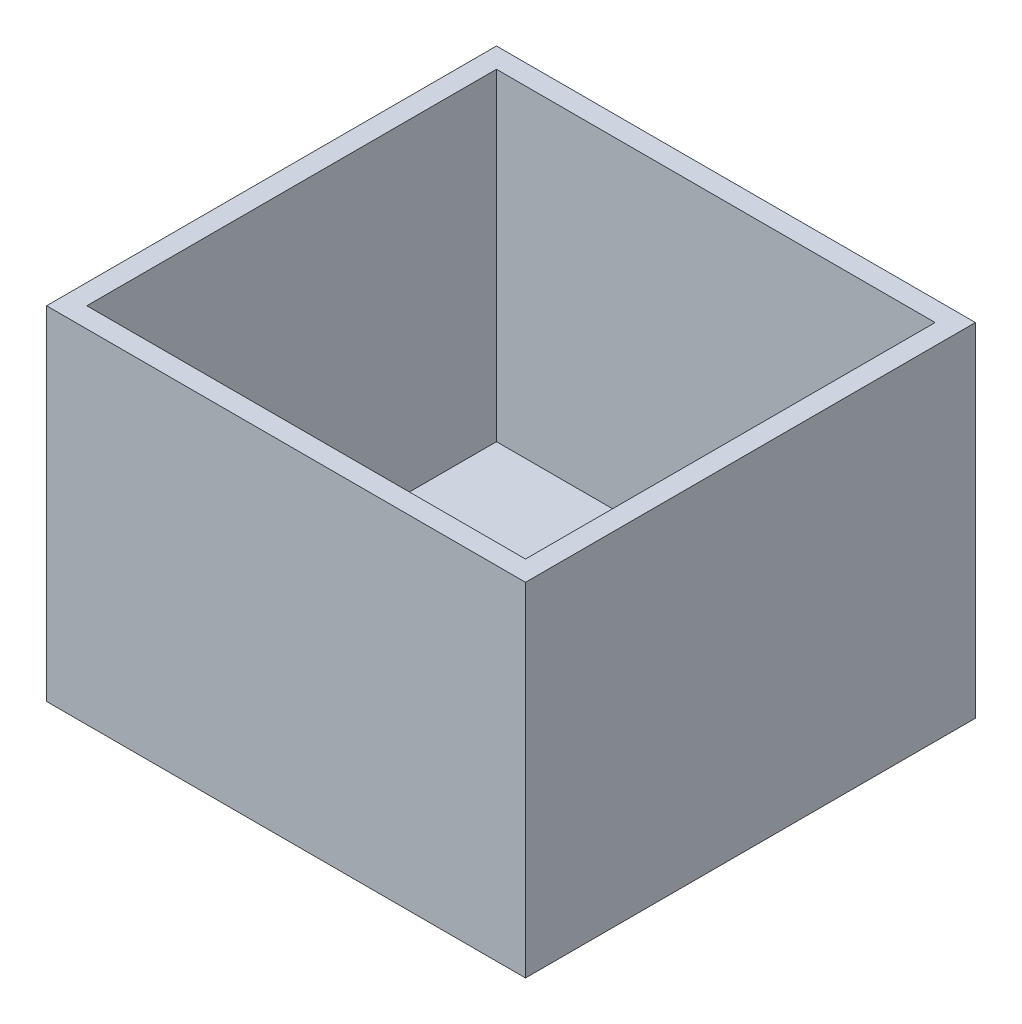
ISO-10303-21;
HEADER;
FILE_DESCRIPTION(('STEP AP214'),'2;1');
FILE_NAME('part.step','',(''),(''),'','','');
FILE_SCHEMA(('AUTOMOTIVE_DESIGN { 1 0 10303 214 1 1 1 1 }'));
ENDSEC;
DATA;
#1=APPLICATION_CONTEXT('core data for automotive mechanical design processes');
#2=APPLICATION_PROTOCOL_DEFINITION('international standard','automotive_design',2000,#1);
#3=PRODUCT_CONTEXT('',#1,'mechanical');
#4=PRODUCT('Part','Part','',(#3));
#5=PRODUCT_RELATED_PRODUCT_CATEGORY('part','',(#4));
#6=PRODUCT_DEFINITION_FORMATION('','',#4);
#7=PRODUCT_DEFINITION_CONTEXT('part definition',#1,'design');
#8=PRODUCT_DEFINITION('design','',#6,#7);
#9=PRODUCT_DEFINITION_SHAPE('','',#8);
#10=(LENGTH_UNIT() NAMED_UNIT(*) SI_UNIT(.MILLI.,.METRE.));
#11=(NAMED_UNIT(*) PLANE_ANGLE_UNIT() SI_UNIT($,.RADIAN.));
#12=(NAMED_UNIT(*) SI_UNIT($,.STERADIAN.) SOLID_ANGLE_UNIT());
#13=UNCERTAINTY_MEASURE_WITH_UNIT(LENGTH_MEASURE(1.E-05),#10,'distance_accuracy_value','');
#14=(GEOMETRIC_REPRESENTATION_CONTEXT(3) GLOBAL_UNCERTAINTY_ASSIGNED_CONTEXT((#13)) GLOBAL_UNIT_ASSIGNED_CONTEXT((#10,
#11,#12)) REPRESENTATION_CONTEXT('',''));
#15=CARTESIAN_POINT('',(0.,0.,0.));
#16=DIRECTION('',(0.,0.,1.));
#17=DIRECTION('',(1.,0.,0.));
#18=AXIS2_PLACEMENT_3D('',#15,#16,#17);
#19=CARTESIAN_POINT('',(-3.175,50.8,0.));
#20=DIRECTION('',(1.,0.,0.));
#21=DIRECTION('',(0.,0.,-1.));
#22=AXIS2_PLACEMENT_3D('',#19,#20,#21);
#23=PLANE('',#22);
#24=DIRECTION('',(0.,0.,1.));
#25=VECTOR('',#24,1.);
#26=CARTESIAN_POINT('',(-3.175,-3.175,0.));
#27=LINE('',#26,#25);
#28=CARTESIAN_POINT('',(-3.175,-3.175,-3.175));
#29=VERTEX_POINT('',#28);
#30=CARTESIAN_POINT('',(-3.17499999999999,-3.175,67.691));
#31=VERTEX_POINT('',#30);
#32=EDGE_CURVE('E121',#29,#31,#27,.T.);
#33=ORIENTED_EDGE('',*,*,#32,.T.);
#34=DIRECTION('',(0.,-1.,0.));
#35=VECTOR('',#34,1.);
#36=CARTESIAN_POINT('',(-3.17499999999999,50.8,67.691));
#37=LINE('',#36,#35);
#38=CARTESIAN_POINT('',(-3.17499999999999,50.8,67.691));
#39=VERTEX_POINT('',#38);
#40=EDGE_CURVE('E11',#39,#31,#37,.T.);
#41=ORIENTED_EDGE('',*,*,#40,.F.);
#42=DIRECTION('',(0.,0.,1.));
#43=VECTOR('',#42,1.);
#44=CARTESIAN_POINT('',(-3.175,50.8,0.));
#45=LINE('',#44,#43);
#46=CARTESIAN_POINT('',(-3.175,50.8,-3.175));
#47=VERTEX_POINT('',#46);
#48=EDGE_CURVE('E157',#47,#39,#45,.T.);
#49=ORIENTED_EDGE('',*,*,#48,.F.);
#50=DIRECTION('',(0.,-1.,0.));
#51=VECTOR('',#50,1.);
#52=CARTESIAN_POINT('',(-3.175,50.8,-3.175));
#53=LINE('',#52,#51);
#54=EDGE_CURVE('E144',#47,#29,#53,.T.);
#55=ORIENTED_EDGE('',*,*,#54,.T.);
#56=EDGE_LOOP('',(#33,#41,#49,#55));
#57=FACE_BOUND('',#56,.T.);
#58=ADVANCED_FACE('F33',(#57),#23,.F.);
#59=CARTESIAN_POINT('',(0.,50.8,67.691));
#60=DIRECTION('',(0.,0.,-1.));
#61=DIRECTION('',(-1.,0.,0.));
#62=AXIS2_PLACEMENT_3D('',#59,#60,#61);
#63=PLANE('',#62);
#64=DIRECTION('',(1.,0.,0.));
#65=VECTOR('',#64,1.);
#66=CARTESIAN_POINT('',(0.,-3.175,67.691));
#67=LINE('',#66,#65);
#68=CARTESIAN_POINT('',(72.263,-3.175,67.691));
#69=VERTEX_POINT('',#68);
#70=EDGE_CURVE('E142',#31,#69,#67,.T.);
#71=ORIENTED_EDGE('',*,*,#70,.T.);
#72=DIRECTION('',(0.,-1.,0.));
#73=VECTOR('',#72,1.);
#74=CARTESIAN_POINT('',(72.263,50.8,67.691));
#75=LINE('',#74,#73);
#76=CARTESIAN_POINT('',(72.263,50.8,67.691));
#77=VERTEX_POINT('',#76);
#78=EDGE_CURVE('E42',#77,#69,#75,.T.);
#79=ORIENTED_EDGE('',*,*,#78,.F.);
#80=DIRECTION('',(1.,0.,0.));
#81=VECTOR('',#80,1.);
#82=CARTESIAN_POINT('',(0.,50.8,67.691));
#83=LINE('',#82,#81);
#84=EDGE_CURVE('E159',#39,#77,#83,.T.);
#85=ORIENTED_EDGE('',*,*,#84,.F.);
#86=ORIENTED_EDGE('',*,*,#40,.T.);
#87=EDGE_LOOP('',(#71,#79,#85,#86));
#88=FACE_BOUND('',#87,.T.);
#89=ADVANCED_FACE('F175',(#88),#63,.F.);
#90=CARTESIAN_POINT('',(72.263,50.8,0.));
#91=DIRECTION('',(-1.,0.,0.));
#92=DIRECTION('',(0.,0.,1.));
#93=AXIS2_PLACEMENT_3D('',#90,#91,#92);
#94=PLANE('',#93);
#95=DIRECTION('',(0.,0.,-1.));
#96=VECTOR('',#95,1.);
#97=CARTESIAN_POINT('',(72.263,-3.175,0.));
#98=LINE('',#97,#96);
#99=CARTESIAN_POINT('',(72.263,-3.175,-3.175));
#100=VERTEX_POINT('',#99);
#101=EDGE_CURVE('E149',#69,#100,#98,.T.);
#102=ORIENTED_EDGE('',*,*,#101,.T.);
#103=DIRECTION('',(0.,-1.,0.));
#104=VECTOR('',#103,1.);
#105=CARTESIAN_POINT('',(72.263,50.8,-3.175));
#106=LINE('',#105,#104);
#107=CARTESIAN_POINT('',(72.263,50.8,-3.175));
#108=VERTEX_POINT('',#107);
#109=EDGE_CURVE('E147',#108,#100,#106,.T.);
#110=ORIENTED_EDGE('',*,*,#109,.F.);
#111=DIRECTION('',(0.,0.,-1.));
#112=VECTOR('',#111,1.);
#113=CARTESIAN_POINT('',(72.263,50.8,0.));
#114=LINE('',#113,#112);
#115=EDGE_CURVE('E160',#77,#108,#114,.T.);
#116=ORIENTED_EDGE('',*,*,#115,.F.);
#117=ORIENTED_EDGE('',*,*,#78,.T.);
#118=EDGE_LOOP('',(#102,#110,#116,#117));
#119=FACE_BOUND('',#118,.T.);
#120=ADVANCED_FACE('F165',(#119),#94,.F.);
#121=CARTESIAN_POINT('',(0.,50.8,-3.175));
#122=DIRECTION('',(0.,0.,1.));
#123=DIRECTION('',(1.,0.,0.));
#124=AXIS2_PLACEMENT_3D('',#121,#122,#123);
#125=PLANE('',#124);
#126=DIRECTION('',(-1.,0.,0.));
#127=VECTOR('',#126,1.);
#128=CARTESIAN_POINT('',(0.,-3.175,-3.175));
#129=LINE('',#128,#127);
#130=EDGE_CURVE('E153',#100,#29,#129,.T.);
#131=ORIENTED_EDGE('',*,*,#130,.T.);
#132=ORIENTED_EDGE('',*,*,#54,.F.);
#133=DIRECTION('',(-1.,0.,0.));
#134=VECTOR('',#133,1.);
#135=CARTESIAN_POINT('',(0.,50.8,-3.175));
#136=LINE('',#135,#134);
#137=EDGE_CURVE('E37',#108,#47,#136,.T.);
#138=ORIENTED_EDGE('',*,*,#137,.F.);
#139=ORIENTED_EDGE('',*,*,#109,.T.);
#140=EDGE_LOOP('',(#131,#132,#138,#139));
#141=FACE_BOUND('',#140,.T.);
#142=ADVANCED_FACE('F169',(#141),#125,.F.);
#143=CARTESIAN_POINT('',(0.,50.8,0.));
#144=DIRECTION('',(0.,1.,0.));
#145=DIRECTION('',(0.,0.,1.));
#146=AXIS2_PLACEMENT_3D('',#143,#144,#145);
#147=PLANE('',#146);
#148=DIRECTION('',(0.,0.,1.));
#149=VECTOR('',#148,1.);
#150=CARTESIAN_POINT('',(0.,50.8,0.));
#151=LINE('',#150,#149);
#152=CARTESIAN_POINT('',(0.,50.8,0.));
#153=VERTEX_POINT('',#152);
#154=CARTESIAN_POINT('',(0.,50.8,64.516));
#155=VERTEX_POINT('',#154);
#156=EDGE_CURVE('E102',#153,#155,#151,.T.);
#157=ORIENTED_EDGE('',*,*,#156,.F.);
#158=DIRECTION('',(-1.,0.,0.));
#159=VECTOR('',#158,1.);
#160=CARTESIAN_POINT('',(0.,50.8,0.));
#161=LINE('',#160,#159);
#162=CARTESIAN_POINT('',(69.088,50.8,0.));
#163=VERTEX_POINT('',#162);
#164=EDGE_CURVE('E128',#163,#153,#161,.T.);
#165=ORIENTED_EDGE('',*,*,#164,.F.);
#166=DIRECTION('',(0.,0.,-1.));
#167=VECTOR('',#166,1.);
#168=CARTESIAN_POINT('',(69.088,50.8,0.));
#169=LINE('',#168,#167);
#170=CARTESIAN_POINT('',(69.088,50.8,64.516));
#171=VERTEX_POINT('',#170);
#172=EDGE_CURVE('E126',#171,#163,#169,.T.);
#173=ORIENTED_EDGE('',*,*,#172,.F.);
#174=DIRECTION('',(1.,0.,0.));
#175=VECTOR('',#174,1.);
#176=CARTESIAN_POINT('',(0.,50.8,64.516));
#177=LINE('',#176,#175);
#178=EDGE_CURVE('E113',#155,#171,#177,.T.);
#179=ORIENTED_EDGE('',*,*,#178,.F.);
#180=EDGE_LOOP('',(#157,#165,#173,#179));
#181=FACE_BOUND('',#180,.T.);
#182=ORIENTED_EDGE('',*,*,#48,.T.);
#183=ORIENTED_EDGE('',*,*,#84,.T.);
#184=ORIENTED_EDGE('',*,*,#115,.T.);
#185=ORIENTED_EDGE('',*,*,#137,.T.);
#186=EDGE_LOOP('',(#182,#183,#184,#185));
#187=FACE_BOUND('',#186,.T.);
#188=ADVANCED_FACE('F125',(#181,#187),#147,.T.);
#189=CARTESIAN_POINT('',(0.,-3.175,0.));
#190=DIRECTION('',(0.,1.,0.));
#191=DIRECTION('',(0.,0.,1.));
#192=AXIS2_PLACEMENT_3D('',#189,#190,#191);
#193=PLANE('',#192);
#194=ORIENTED_EDGE('',*,*,#32,.F.);
#195=ORIENTED_EDGE('',*,*,#130,.F.);
#196=ORIENTED_EDGE('',*,*,#101,.F.);
#197=ORIENTED_EDGE('',*,*,#70,.F.);
#198=EDGE_LOOP('',(#194,#195,#196,#197));
#199=FACE_BOUND('',#198,.T.);
#200=ADVANCED_FACE('F35',(#199),#193,.F.);
#201=CARTESIAN_POINT('',(0.,50.8,0.));
#202=DIRECTION('',(1.,0.,0.));
#203=DIRECTION('',(0.,0.,-1.));
#204=AXIS2_PLACEMENT_3D('',#201,#202,#203);
#205=PLANE('',#204);
#206=DIRECTION('',(0.,0.,1.));
#207=VECTOR('',#206,1.);
#208=CARTESIAN_POINT('',(0.,0.,0.));
#209=LINE('',#208,#207);
#210=CARTESIAN_POINT('',(0.,0.,0.));
#211=VERTEX_POINT('',#210);
#212=CARTESIAN_POINT('',(0.,0.,64.516));
#213=VERTEX_POINT('',#212);
#214=EDGE_CURVE('E132',#211,#213,#209,.T.);
#215=ORIENTED_EDGE('',*,*,#214,.F.);
#216=DIRECTION('',(0.,-1.,0.));
#217=VECTOR('',#216,1.);
#218=CARTESIAN_POINT('',(0.,50.8,0.));
#219=LINE('',#218,#217);
#220=EDGE_CURVE('E109',#153,#211,#219,.T.);
#221=ORIENTED_EDGE('',*,*,#220,.F.);
#222=ORIENTED_EDGE('',*,*,#156,.T.);
#223=DIRECTION('',(0.,-1.,0.));
#224=VECTOR('',#223,1.);
#225=CARTESIAN_POINT('',(0.,50.8,64.516));
#226=LINE('',#225,#224);
#227=EDGE_CURVE('E106',#155,#213,#226,.T.);
#228=ORIENTED_EDGE('',*,*,#227,.T.);
#229=EDGE_LOOP('',(#215,#221,#222,#228));
#230=FACE_BOUND('',#229,.T.);
#231=ADVANCED_FACE('F105',(#230),#205,.T.);
#232=CARTESIAN_POINT('',(0.,50.8,64.516));
#233=DIRECTION('',(0.,0.,-1.));
#234=DIRECTION('',(-1.,0.,0.));
#235=AXIS2_PLACEMENT_3D('',#232,#233,#234);
#236=PLANE('',#235);
#237=DIRECTION('',(1.,0.,0.));
#238=VECTOR('',#237,1.);
#239=CARTESIAN_POINT('',(0.,0.,64.516));
#240=LINE('',#239,#238);
#241=CARTESIAN_POINT('',(69.088,0.,64.516));
#242=VERTEX_POINT('',#241);
#243=EDGE_CURVE('E120',#213,#242,#240,.T.);
#244=ORIENTED_EDGE('',*,*,#243,.F.);
#245=ORIENTED_EDGE('',*,*,#227,.F.);
#246=ORIENTED_EDGE('',*,*,#178,.T.);
#247=DIRECTION('',(0.,-1.,0.));
#248=VECTOR('',#247,1.);
#249=CARTESIAN_POINT('',(69.088,50.8,64.516));
#250=LINE('',#249,#248);
#251=EDGE_CURVE('E122',#171,#242,#250,.T.);
#252=ORIENTED_EDGE('',*,*,#251,.T.);
#253=EDGE_LOOP('',(#244,#245,#246,#252));
#254=FACE_BOUND('',#253,.T.);
#255=ADVANCED_FACE('F117',(#254),#236,.T.);
#256=CARTESIAN_POINT('',(69.088,50.8,0.));
#257=DIRECTION('',(-1.,0.,0.));
#258=DIRECTION('',(0.,0.,1.));
#259=AXIS2_PLACEMENT_3D('',#256,#257,#258);
#260=PLANE('',#259);
#261=DIRECTION('',(0.,0.,-1.));
#262=VECTOR('',#261,1.);
#263=CARTESIAN_POINT('',(69.088,0.,0.));
#264=LINE('',#263,#262);
#265=CARTESIAN_POINT('',(69.088,0.,0.));
#266=VERTEX_POINT('',#265);
#267=EDGE_CURVE('E135',#242,#266,#264,.T.);
#268=ORIENTED_EDGE('',*,*,#267,.F.);
#269=ORIENTED_EDGE('',*,*,#251,.F.);
#270=ORIENTED_EDGE('',*,*,#172,.T.);
#271=DIRECTION('',(0.,-1.,0.));
#272=VECTOR('',#271,1.);
#273=CARTESIAN_POINT('',(69.088,50.8,0.));
#274=LINE('',#273,#272);
#275=EDGE_CURVE('E50',#163,#266,#274,.T.);
#276=ORIENTED_EDGE('',*,*,#275,.T.);
#277=EDGE_LOOP('',(#268,#269,#270,#276));
#278=FACE_BOUND('',#277,.T.);
#279=ADVANCED_FACE('F220',(#278),#260,.T.);
#280=CARTESIAN_POINT('',(0.,50.8,0.));
#281=DIRECTION('',(0.,0.,1.));
#282=DIRECTION('',(1.,0.,0.));
#283=AXIS2_PLACEMENT_3D('',#280,#281,#282);
#284=PLANE('',#283);
#285=DIRECTION('',(-1.,0.,0.));
#286=VECTOR('',#285,1.);
#287=CARTESIAN_POINT('',(0.,0.,0.));
#288=LINE('',#287,#286);
#289=EDGE_CURVE('E114',#266,#211,#288,.T.);
#290=ORIENTED_EDGE('',*,*,#289,.F.);
#291=ORIENTED_EDGE('',*,*,#275,.F.);
#292=ORIENTED_EDGE('',*,*,#164,.T.);
#293=ORIENTED_EDGE('',*,*,#220,.T.);
#294=EDGE_LOOP('',(#290,#291,#292,#293));
#295=FACE_BOUND('',#294,.T.);
#296=ADVANCED_FACE('F229',(#295),#284,.T.);
#297=CARTESIAN_POINT('',(0.,0.,0.));
#298=DIRECTION('',(0.,1.,0.));
#299=DIRECTION('',(0.,0.,1.));
#300=AXIS2_PLACEMENT_3D('',#297,#298,#299);
#301=PLANE('',#300);
#302=ORIENTED_EDGE('',*,*,#214,.T.);
#303=ORIENTED_EDGE('',*,*,#243,.T.);
#304=ORIENTED_EDGE('',*,*,#267,.T.);
#305=ORIENTED_EDGE('',*,*,#289,.T.);
#306=EDGE_LOOP('',(#302,#303,#304,#305));
#307=FACE_BOUND('',#306,.T.);
#308=ADVANCED_FACE('F239',(#307),#301,.T.);
#309=CLOSED_SHELL('',(#58,#89,#120,#142,#188,#200,#231,#255,#279,#296,#308));
#310=MANIFOLD_SOLID_BREP('B2',#309);
#311=ADVANCED_BREP_SHAPE_REPRESENTATION('',(#18,#310),#14);
#312=SHAPE_DEFINITION_REPRESENTATION(#9,#311);
ENDSEC;
END-ISO-10303-21;
